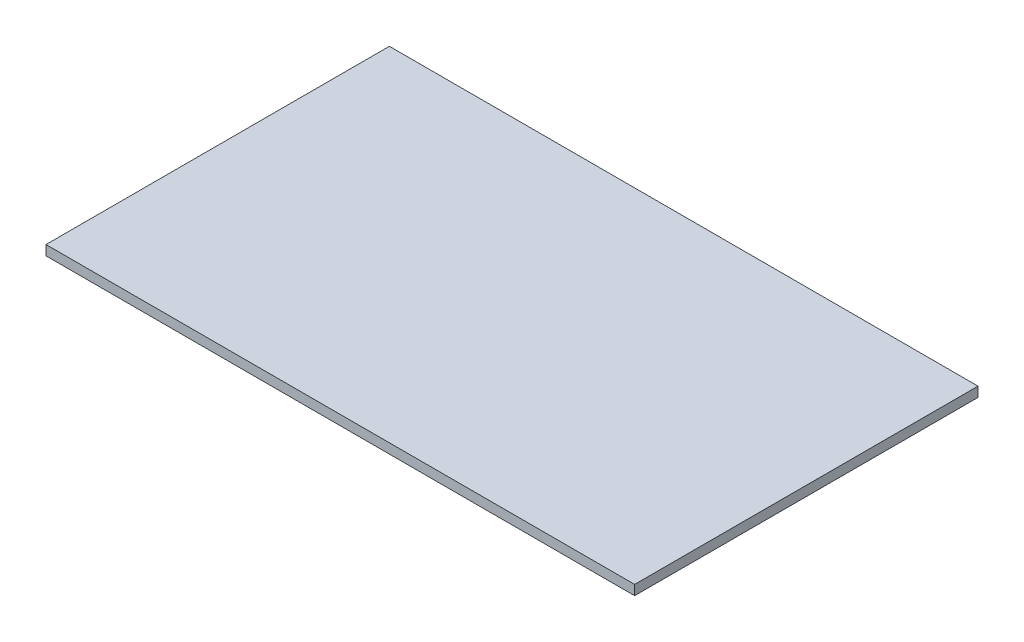
ISO-10303-21;
HEADER;
FILE_DESCRIPTION(('STEP AP214'),'2;1');
FILE_NAME('part.step','',(''),(''),'','','');
FILE_SCHEMA(('AUTOMOTIVE_DESIGN { 1 0 10303 214 1 1 1 1 }'));
ENDSEC;
DATA;
#1=APPLICATION_CONTEXT('core data for automotive mechanical design processes');
#2=APPLICATION_PROTOCOL_DEFINITION('international standard','automotive_design',2000,#1);
#3=PRODUCT_CONTEXT('',#1,'mechanical');
#4=PRODUCT('Part','Part','',(#3));
#5=PRODUCT_RELATED_PRODUCT_CATEGORY('part','',(#4));
#6=PRODUCT_DEFINITION_FORMATION('','',#4);
#7=PRODUCT_DEFINITION_CONTEXT('part definition',#1,'design');
#8=PRODUCT_DEFINITION('design','',#6,#7);
#9=PRODUCT_DEFINITION_SHAPE('','',#8);
#10=(LENGTH_UNIT() NAMED_UNIT(*) SI_UNIT(.MILLI.,.METRE.));
#11=(NAMED_UNIT(*) PLANE_ANGLE_UNIT() SI_UNIT($,.RADIAN.));
#12=(NAMED_UNIT(*) SI_UNIT($,.STERADIAN.) SOLID_ANGLE_UNIT());
#13=UNCERTAINTY_MEASURE_WITH_UNIT(LENGTH_MEASURE(1.E-05),#10,'distance_accuracy_value','');
#14=(GEOMETRIC_REPRESENTATION_CONTEXT(3) GLOBAL_UNCERTAINTY_ASSIGNED_CONTEXT((#13)) GLOBAL_UNIT_ASSIGNED_CONTEXT((#10,
#11,#12)) REPRESENTATION_CONTEXT('',''));
#15=CARTESIAN_POINT('',(0.,0.,0.));
#16=DIRECTION('',(0.,0.,1.));
#17=DIRECTION('',(1.,0.,0.));
#18=AXIS2_PLACEMENT_3D('',#15,#16,#17);
#19=CARTESIAN_POINT('',(300.,10.,175.));
#20=DIRECTION('',(-1.,0.,0.));
#21=DIRECTION('',(0.,0.,1.));
#22=AXIS2_PLACEMENT_3D('',#19,#20,#21);
#23=PLANE('',#22);
#24=DIRECTION('',(0.,0.,-1.));
#25=VECTOR('',#24,1.);
#26=CARTESIAN_POINT('',(300.,0.,175.));
#27=LINE('',#26,#25);
#28=CARTESIAN_POINT('',(300.,0.,175.));
#29=VERTEX_POINT('',#28);
#30=CARTESIAN_POINT('',(300.,0.,-175.));
#31=VERTEX_POINT('',#30);
#32=EDGE_CURVE('E96',#29,#31,#27,.T.);
#33=ORIENTED_EDGE('',*,*,#32,.T.);
#34=DIRECTION('',(0.,-1.,0.));
#35=VECTOR('',#34,1.);
#36=CARTESIAN_POINT('',(300.,10.,-175.));
#37=LINE('',#36,#35);
#38=CARTESIAN_POINT('',(300.,10.,-175.));
#39=VERTEX_POINT('',#38);
#40=EDGE_CURVE('E11',#39,#31,#37,.T.);
#41=ORIENTED_EDGE('',*,*,#40,.F.);
#42=DIRECTION('',(0.,0.,-1.));
#43=VECTOR('',#42,1.);
#44=CARTESIAN_POINT('',(300.,10.,175.));
#45=LINE('',#44,#43);
#46=CARTESIAN_POINT('',(300.,10.,175.));
#47=VERTEX_POINT('',#46);
#48=EDGE_CURVE('E84',#47,#39,#45,.T.);
#49=ORIENTED_EDGE('',*,*,#48,.F.);
#50=DIRECTION('',(0.,-1.,0.));
#51=VECTOR('',#50,1.);
#52=CARTESIAN_POINT('',(300.,10.,175.));
#53=LINE('',#52,#51);
#54=EDGE_CURVE('E92',#47,#29,#53,.T.);
#55=ORIENTED_EDGE('',*,*,#54,.T.);
#56=EDGE_LOOP('',(#33,#41,#49,#55));
#57=FACE_BOUND('',#56,.T.);
#58=ADVANCED_FACE('F33',(#57),#23,.F.);
#59=CARTESIAN_POINT('',(-300.,10.,-175.));
#60=DIRECTION('',(0.,0.,1.));
#61=DIRECTION('',(1.,0.,0.));
#62=AXIS2_PLACEMENT_3D('',#59,#60,#61);
#63=PLANE('',#62);
#64=DIRECTION('',(-1.,0.,0.));
#65=VECTOR('',#64,1.);
#66=CARTESIAN_POINT('',(-300.,0.,-175.));
#67=LINE('',#66,#65);
#68=CARTESIAN_POINT('',(-300.,0.,-175.));
#69=VERTEX_POINT('',#68);
#70=EDGE_CURVE('E88',#31,#69,#67,.T.);
#71=ORIENTED_EDGE('',*,*,#70,.T.);
#72=DIRECTION('',(0.,-1.,0.));
#73=VECTOR('',#72,1.);
#74=CARTESIAN_POINT('',(-300.,10.,-175.));
#75=LINE('',#74,#73);
#76=CARTESIAN_POINT('',(-300.,10.,-175.));
#77=VERTEX_POINT('',#76);
#78=EDGE_CURVE('E41',#77,#69,#75,.T.);
#79=ORIENTED_EDGE('',*,*,#78,.F.);
#80=DIRECTION('',(-1.,0.,0.));
#81=VECTOR('',#80,1.);
#82=CARTESIAN_POINT('',(-300.,10.,-175.));
#83=LINE('',#82,#81);
#84=EDGE_CURVE('E79',#39,#77,#83,.T.);
#85=ORIENTED_EDGE('',*,*,#84,.F.);
#86=ORIENTED_EDGE('',*,*,#40,.T.);
#87=EDGE_LOOP('',(#71,#79,#85,#86));
#88=FACE_BOUND('',#87,.T.);
#89=ADVANCED_FACE('F87',(#88),#63,.F.);
#90=CARTESIAN_POINT('',(-300.,10.,175.));
#91=DIRECTION('',(1.,0.,0.));
#92=DIRECTION('',(0.,0.,-1.));
#93=AXIS2_PLACEMENT_3D('',#90,#91,#92);
#94=PLANE('',#93);
#95=DIRECTION('',(0.,0.,1.));
#96=VECTOR('',#95,1.);
#97=CARTESIAN_POINT('',(-300.,0.,175.));
#98=LINE('',#97,#96);
#99=CARTESIAN_POINT('',(-300.,0.,175.));
#100=VERTEX_POINT('',#99);
#101=EDGE_CURVE('E66',#69,#100,#98,.T.);
#102=ORIENTED_EDGE('',*,*,#101,.T.);
#103=DIRECTION('',(0.,-1.,0.));
#104=VECTOR('',#103,1.);
#105=CARTESIAN_POINT('',(-300.,10.,175.));
#106=LINE('',#105,#104);
#107=CARTESIAN_POINT('',(-300.,10.,175.));
#108=VERTEX_POINT('',#107);
#109=EDGE_CURVE('E89',#108,#100,#106,.T.);
#110=ORIENTED_EDGE('',*,*,#109,.F.);
#111=DIRECTION('',(0.,0.,1.));
#112=VECTOR('',#111,1.);
#113=CARTESIAN_POINT('',(-300.,10.,175.));
#114=LINE('',#113,#112);
#115=EDGE_CURVE('E82',#77,#108,#114,.T.);
#116=ORIENTED_EDGE('',*,*,#115,.F.);
#117=ORIENTED_EDGE('',*,*,#78,.T.);
#118=EDGE_LOOP('',(#102,#110,#116,#117));
#119=FACE_BOUND('',#118,.T.);
#120=ADVANCED_FACE('F90',(#119),#94,.F.);
#121=CARTESIAN_POINT('',(-300.,10.,175.));
#122=DIRECTION('',(0.,0.,-1.));
#123=DIRECTION('',(-1.,0.,0.));
#124=AXIS2_PLACEMENT_3D('',#121,#122,#123);
#125=PLANE('',#124);
#126=DIRECTION('',(1.,0.,0.));
#127=VECTOR('',#126,1.);
#128=CARTESIAN_POINT('',(-300.,0.,175.));
#129=LINE('',#128,#127);
#130=EDGE_CURVE('E72',#100,#29,#129,.T.);
#131=ORIENTED_EDGE('',*,*,#130,.T.);
#132=ORIENTED_EDGE('',*,*,#54,.F.);
#133=DIRECTION('',(1.,0.,0.));
#134=VECTOR('',#133,1.);
#135=CARTESIAN_POINT('',(-300.,10.,175.));
#136=LINE('',#135,#134);
#137=EDGE_CURVE('E49',#108,#47,#136,.T.);
#138=ORIENTED_EDGE('',*,*,#137,.F.);
#139=ORIENTED_EDGE('',*,*,#109,.T.);
#140=EDGE_LOOP('',(#131,#132,#138,#139));
#141=FACE_BOUND('',#140,.T.);
#142=ADVANCED_FACE('F103',(#141),#125,.F.);
#143=CARTESIAN_POINT('',(0.,10.,0.));
#144=DIRECTION('',(0.,-1.,0.));
#145=DIRECTION('',(0.,0.,-1.));
#146=AXIS2_PLACEMENT_3D('',#143,#144,#145);
#147=PLANE('',#146);
#148=ORIENTED_EDGE('',*,*,#48,.T.);
#149=ORIENTED_EDGE('',*,*,#84,.T.);
#150=ORIENTED_EDGE('',*,*,#115,.T.);
#151=ORIENTED_EDGE('',*,*,#137,.T.);
#152=EDGE_LOOP('',(#148,#149,#150,#151));
#153=FACE_BOUND('',#152,.T.);
#154=ADVANCED_FACE('F80',(#153),#147,.F.);
#155=CARTESIAN_POINT('',(0.,0.,0.));
#156=DIRECTION('',(0.,-1.,0.));
#157=DIRECTION('',(0.,0.,-1.));
#158=AXIS2_PLACEMENT_3D('',#155,#156,#157);
#159=PLANE('',#158);
#160=ORIENTED_EDGE('',*,*,#32,.F.);
#161=ORIENTED_EDGE('',*,*,#130,.F.);
#162=ORIENTED_EDGE('',*,*,#101,.F.);
#163=ORIENTED_EDGE('',*,*,#70,.F.);
#164=EDGE_LOOP('',(#160,#161,#162,#163));
#165=FACE_BOUND('',#164,.T.);
#166=ADVANCED_FACE('F106',(#165),#159,.T.);
#167=CLOSED_SHELL('',(#58,#89,#120,#142,#154,#166));
#168=MANIFOLD_SOLID_BREP('B2',#167);
#169=ADVANCED_BREP_SHAPE_REPRESENTATION('',(#18,#168),#14);
#170=SHAPE_DEFINITION_REPRESENTATION(#9,#169);
ENDSEC;
END-ISO-10303-21;
